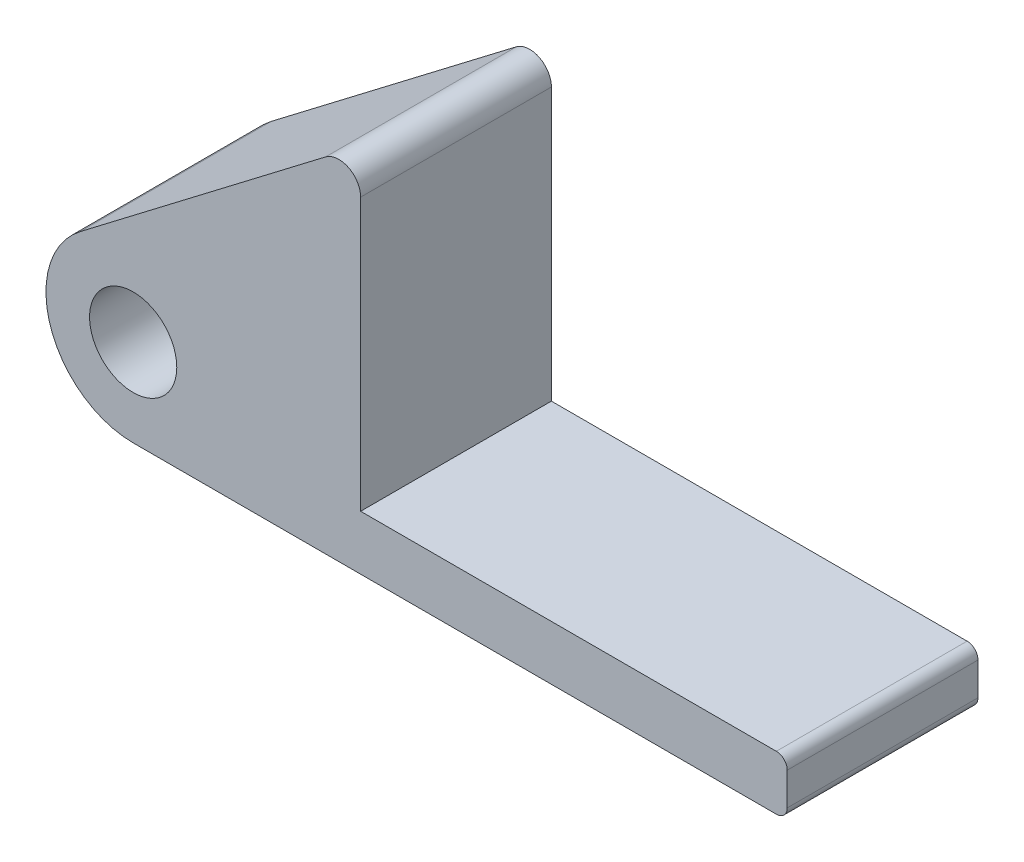
ISO-10303-21;
HEADER;
FILE_DESCRIPTION(('STEP AP214'),'2;1');
FILE_NAME('part.step','',(''),(''),'','','');
FILE_SCHEMA(('AUTOMOTIVE_DESIGN { 1 0 10303 214 1 1 1 1 }'));
ENDSEC;
DATA;
#1=APPLICATION_CONTEXT('core data for automotive mechanical design processes');
#2=APPLICATION_PROTOCOL_DEFINITION('international standard','automotive_design',2000,#1);
#3=PRODUCT_CONTEXT('',#1,'mechanical');
#4=PRODUCT('Part','Part','',(#3));
#5=PRODUCT_RELATED_PRODUCT_CATEGORY('part','',(#4));
#6=PRODUCT_DEFINITION_FORMATION('','',#4);
#7=PRODUCT_DEFINITION_CONTEXT('part definition',#1,'design');
#8=PRODUCT_DEFINITION('design','',#6,#7);
#9=PRODUCT_DEFINITION_SHAPE('','',#8);
#10=(LENGTH_UNIT() NAMED_UNIT(*) SI_UNIT(.MILLI.,.METRE.));
#11=(NAMED_UNIT(*) PLANE_ANGLE_UNIT() SI_UNIT($,.RADIAN.));
#12=(NAMED_UNIT(*) SI_UNIT($,.STERADIAN.) SOLID_ANGLE_UNIT());
#13=UNCERTAINTY_MEASURE_WITH_UNIT(LENGTH_MEASURE(1.E-05),#10,'distance_accuracy_value','');
#14=(GEOMETRIC_REPRESENTATION_CONTEXT(3) GLOBAL_UNCERTAINTY_ASSIGNED_CONTEXT((#13)) GLOBAL_UNIT_ASSIGNED_CONTEXT((#10,
#11,#12)) REPRESENTATION_CONTEXT('',''));
#15=CARTESIAN_POINT('',(0.,0.,0.));
#16=DIRECTION('',(0.,0.,1.));
#17=DIRECTION('',(1.,0.,0.));
#18=AXIS2_PLACEMENT_3D('',#15,#16,#17);
#19=CARTESIAN_POINT('',(-4.85521438282336,6.358214631233,-17.5));
#20=DIRECTION('',(0.606901797852919,-0.794776828904124,0.));
#21=DIRECTION('',(0.794776828904124,0.606901797852919,0.));
#22=AXIS2_PLACEMENT_3D('',#19,#20,#21);
#23=PLANE('',#22);
#24=DIRECTION('',(0.794776828904124,0.606901797852919,0.));
#25=VECTOR('',#24,1.);
#26=CARTESIAN_POINT('',(-4.85521438282336,6.358214631233,0.));
#27=LINE('',#26,#25);
#28=CARTESIAN_POINT('',(-4.85521438282336,6.35821463123299,0.));
#29=VERTEX_POINT('',#28);
#30=CARTESIAN_POINT('',(17.653159719134,23.5458982833339,0.));
#31=VERTEX_POINT('',#30);
#32=EDGE_CURVE('E165',#29,#31,#27,.T.);
#33=ORIENTED_EDGE('',*,*,#32,.T.);
#34=DIRECTION('',(0.,0.,1.));
#35=VECTOR('',#34,1.);
#36=CARTESIAN_POINT('',(17.653159719134,23.5458982833339,-17.5));
#37=LINE('',#36,#35);
#38=CARTESIAN_POINT('',(17.653159719134,23.5458982833339,-17.5));
#39=VERTEX_POINT('',#38);
#40=EDGE_CURVE('E137',#31,#39,#37,.F.);
#41=ORIENTED_EDGE('',*,*,#40,.T.);
#42=DIRECTION('',(0.794776828904124,0.606901797852919,0.));
#43=VECTOR('',#42,1.);
#44=CARTESIAN_POINT('',(-4.85521438282336,6.358214631233,-17.5));
#45=LINE('',#44,#43);
#46=CARTESIAN_POINT('',(-4.85521438282336,6.35821463123299,-17.5));
#47=VERTEX_POINT('',#46);
#48=EDGE_CURVE('E135',#47,#39,#45,.T.);
#49=ORIENTED_EDGE('',*,*,#48,.F.);
#50=DIRECTION('',(0.,0.,1.));
#51=VECTOR('',#50,1.);
#52=CARTESIAN_POINT('',(-4.85521438282336,6.35821463123299,-17.5));
#53=LINE('',#52,#51);
#54=EDGE_CURVE('E119',#47,#29,#53,.T.);
#55=ORIENTED_EDGE('',*,*,#54,.T.);
#56=EDGE_LOOP('',(#33,#41,#49,#55));
#57=FACE_BOUND('',#56,.T.);
#58=ADVANCED_FACE('F45',(#57),#23,.F.);
#59=CARTESIAN_POINT('',(20.8669633148398,0.,-17.5));
#60=DIRECTION('',(-1.,0.,0.));
#61=DIRECTION('',(0.,-1.,0.));
#62=AXIS2_PLACEMENT_3D('',#59,#60,#61);
#63=PLANE('',#62);
#64=DIRECTION('',(0.,-1.,0.));
#65=VECTOR('',#64,1.);
#66=CARTESIAN_POINT('',(20.8669633148398,0.,-17.5));
#67=LINE('',#66,#65);
#68=CARTESIAN_POINT('',(20.8669633148398,21.9563446255256,-17.5));
#69=VERTEX_POINT('',#68);
#70=CARTESIAN_POINT('',(20.8669633148398,-3.,-17.5));
#71=VERTEX_POINT('',#70);
#72=EDGE_CURVE('E159',#69,#71,#67,.T.);
#73=ORIENTED_EDGE('',*,*,#72,.F.);
#74=DIRECTION('',(0.,0.,1.));
#75=VECTOR('',#74,1.);
#76=CARTESIAN_POINT('',(20.8669633148398,21.9563446255256,-17.5));
#77=LINE('',#76,#75);
#78=CARTESIAN_POINT('',(20.8669633148398,21.9563446255256,0.));
#79=VERTEX_POINT('',#78);
#80=EDGE_CURVE('E189',#69,#79,#77,.T.);
#81=ORIENTED_EDGE('',*,*,#80,.T.);
#82=DIRECTION('',(0.,-1.,0.));
#83=VECTOR('',#82,1.);
#84=CARTESIAN_POINT('',(20.8669633148398,0.,0.));
#85=LINE('',#84,#83);
#86=CARTESIAN_POINT('',(20.8669633148398,-3.,0.));
#87=VERTEX_POINT('',#86);
#88=EDGE_CURVE('E179',#79,#87,#85,.T.);
#89=ORIENTED_EDGE('',*,*,#88,.T.);
#90=DIRECTION('',(0.,0.,1.));
#91=VECTOR('',#90,1.);
#92=CARTESIAN_POINT('',(20.8669633148398,-3.,-17.5));
#93=LINE('',#92,#91);
#94=EDGE_CURVE('E185',#71,#87,#93,.T.);
#95=ORIENTED_EDGE('',*,*,#94,.F.);
#96=EDGE_LOOP('',(#73,#81,#89,#95));
#97=FACE_BOUND('',#96,.T.);
#98=ADVANCED_FACE('F243',(#97),#63,.F.);
#99=CARTESIAN_POINT('',(0.,-3.00000000000001,-17.5));
#100=DIRECTION('',(0.,-1.,0.));
#101=DIRECTION('',(1.,0.,0.));
#102=AXIS2_PLACEMENT_3D('',#99,#100,#101);
#103=PLANE('',#102);
#104=DIRECTION('',(1.,0.,0.));
#105=VECTOR('',#104,1.);
#106=CARTESIAN_POINT('',(0.,-3.00000000000001,0.));
#107=LINE('',#106,#105);
#108=CARTESIAN_POINT('',(59.,-3.,0.));
#109=VERTEX_POINT('',#108);
#110=EDGE_CURVE('E176',#87,#109,#107,.T.);
#111=ORIENTED_EDGE('',*,*,#110,.T.);
#112=DIRECTION('',(0.,0.,1.));
#113=VECTOR('',#112,1.);
#114=CARTESIAN_POINT('',(59.,-3.,-17.5));
#115=LINE('',#114,#113);
#116=CARTESIAN_POINT('',(59.,-3.,-17.5));
#117=VERTEX_POINT('',#116);
#118=EDGE_CURVE('E11',#109,#117,#115,.F.);
#119=ORIENTED_EDGE('',*,*,#118,.T.);
#120=DIRECTION('',(1.,0.,0.));
#121=VECTOR('',#120,1.);
#122=CARTESIAN_POINT('',(0.,-3.00000000000001,-17.5));
#123=LINE('',#122,#121);
#124=EDGE_CURVE('E156',#71,#117,#123,.T.);
#125=ORIENTED_EDGE('',*,*,#124,.F.);
#126=ORIENTED_EDGE('',*,*,#94,.T.);
#127=EDGE_LOOP('',(#111,#119,#125,#126));
#128=FACE_BOUND('',#127,.T.);
#129=ADVANCED_FACE('F239',(#128),#103,.F.);
#130=CARTESIAN_POINT('',(60.,0.,-17.5));
#131=DIRECTION('',(-1.,0.,0.));
#132=DIRECTION('',(0.,0.,1.));
#133=AXIS2_PLACEMENT_3D('',#130,#131,#132);
#134=PLANE('',#133);
#135=DIRECTION('',(0.,-1.,0.));
#136=VECTOR('',#135,1.);
#137=CARTESIAN_POINT('',(60.,0.,0.));
#138=LINE('',#137,#136);
#139=CARTESIAN_POINT('',(60.,-4.,0.));
#140=VERTEX_POINT('',#139);
#141=CARTESIAN_POINT('',(60.,-7.,0.));
#142=VERTEX_POINT('',#141);
#143=EDGE_CURVE('E173',#140,#142,#138,.T.);
#144=ORIENTED_EDGE('',*,*,#143,.T.);
#145=DIRECTION('',(0.,0.,1.));
#146=VECTOR('',#145,1.);
#147=CARTESIAN_POINT('',(60.,-7.,-17.5));
#148=LINE('',#147,#146);
#149=CARTESIAN_POINT('',(60.,-7.,-17.5));
#150=VERTEX_POINT('',#149);
#151=EDGE_CURVE('E67',#142,#150,#148,.F.);
#152=ORIENTED_EDGE('',*,*,#151,.T.);
#153=DIRECTION('',(0.,-1.,0.));
#154=VECTOR('',#153,1.);
#155=CARTESIAN_POINT('',(60.,0.,-17.5));
#156=LINE('',#155,#154);
#157=CARTESIAN_POINT('',(60.,-4.,-17.5));
#158=VERTEX_POINT('',#157);
#159=EDGE_CURVE('E151',#158,#150,#156,.T.);
#160=ORIENTED_EDGE('',*,*,#159,.F.);
#161=DIRECTION('',(0.,0.,1.));
#162=VECTOR('',#161,1.);
#163=CARTESIAN_POINT('',(60.,-4.,-17.5));
#164=LINE('',#163,#162);
#165=EDGE_CURVE('E213',#158,#140,#164,.T.);
#166=ORIENTED_EDGE('',*,*,#165,.T.);
#167=EDGE_LOOP('',(#144,#152,#160,#166));
#168=FACE_BOUND('',#167,.T.);
#169=ADVANCED_FACE('F233',(#168),#134,.F.);
#170=CARTESIAN_POINT('',(0.,-8.,-17.5));
#171=DIRECTION('',(0.,1.,0.));
#172=DIRECTION('',(0.,0.,1.));
#173=AXIS2_PLACEMENT_3D('',#170,#171,#172);
#174=PLANE('',#173);
#175=DIRECTION('',(-1.,0.,0.));
#176=VECTOR('',#175,1.);
#177=CARTESIAN_POINT('',(0.,-8.,-17.5));
#178=LINE('',#177,#176);
#179=CARTESIAN_POINT('',(59.,-8.,-17.5));
#180=VERTEX_POINT('',#179);
#181=CARTESIAN_POINT('',(0.,-8.,-17.5));
#182=VERTEX_POINT('',#181);
#183=EDGE_CURVE('E146',#180,#182,#178,.T.);
#184=ORIENTED_EDGE('',*,*,#183,.F.);
#185=DIRECTION('',(0.,0.,1.));
#186=VECTOR('',#185,1.);
#187=CARTESIAN_POINT('',(59.,-8.,-17.5));
#188=LINE('',#187,#186);
#189=CARTESIAN_POINT('',(59.,-8.,0.));
#190=VERTEX_POINT('',#189);
#191=EDGE_CURVE('E203',#180,#190,#188,.T.);
#192=ORIENTED_EDGE('',*,*,#191,.T.);
#193=DIRECTION('',(-1.,0.,0.));
#194=VECTOR('',#193,1.);
#195=CARTESIAN_POINT('',(0.,-8.,0.));
#196=LINE('',#195,#194);
#197=CARTESIAN_POINT('',(0.,-8.,0.));
#198=VERTEX_POINT('',#197);
#199=EDGE_CURVE('E170',#190,#198,#196,.T.);
#200=ORIENTED_EDGE('',*,*,#199,.T.);
#201=DIRECTION('',(0.,0.,1.));
#202=VECTOR('',#201,1.);
#203=CARTESIAN_POINT('',(0.,-8.,-17.5));
#204=LINE('',#203,#202);
#205=EDGE_CURVE('E131',#182,#198,#204,.T.);
#206=ORIENTED_EDGE('',*,*,#205,.F.);
#207=EDGE_LOOP('',(#184,#192,#200,#206));
#208=FACE_BOUND('',#207,.T.);
#209=ADVANCED_FACE('F226',(#208),#174,.F.);
#210=CARTESIAN_POINT('',(0.,0.,-17.5));
#211=DIRECTION('',(0.,0.,1.));
#212=DIRECTION('',(1.,0.,0.));
#213=AXIS2_PLACEMENT_3D('',#210,#211,#212);
#214=CYLINDRICAL_SURFACE('',#213,8.);
#215=CARTESIAN_POINT('',(0.,0.,0.));
#216=DIRECTION('',(0.,0.,1.));
#217=DIRECTION('',(1.,0.,0.));
#218=AXIS2_PLACEMENT_3D('',#215,#216,#217);
#219=CIRCLE('',#218,8.);
#220=EDGE_CURVE('E126',#29,#198,#219,.T.);
#221=ORIENTED_EDGE('',*,*,#220,.F.);
#222=ORIENTED_EDGE('',*,*,#54,.F.);
#223=CARTESIAN_POINT('',(0.,0.,-17.5));
#224=DIRECTION('',(0.,0.,1.));
#225=DIRECTION('',(1.,0.,0.));
#226=AXIS2_PLACEMENT_3D('',#223,#224,#225);
#227=CIRCLE('',#226,8.);
#228=EDGE_CURVE('E124',#47,#182,#227,.T.);
#229=ORIENTED_EDGE('',*,*,#228,.T.);
#230=ORIENTED_EDGE('',*,*,#205,.T.);
#231=EDGE_LOOP('',(#221,#222,#229,#230));
#232=FACE_BOUND('',#231,.T.);
#233=ADVANCED_FACE('F121',(#232),#214,.T.);
#234=CARTESIAN_POINT('',(0.,0.,-17.5));
#235=DIRECTION('',(0.,0.,1.));
#236=DIRECTION('',(1.,0.,0.));
#237=AXIS2_PLACEMENT_3D('',#234,#235,#236);
#238=CYLINDRICAL_SURFACE('',#237,4.);
#239=CARTESIAN_POINT('',(0.,0.,-17.5));
#240=DIRECTION('',(0.,0.,1.));
#241=DIRECTION('',(1.,0.,0.));
#242=AXIS2_PLACEMENT_3D('',#239,#240,#241);
#243=CIRCLE('',#242,4.);
#244=CARTESIAN_POINT('',(4.,0.,-17.5));
#245=VERTEX_POINT('',#244);
#246=EDGE_CURVE('E132',#245,#245,#243,.T.);
#247=ORIENTED_EDGE('',*,*,#246,.F.);
#248=EDGE_LOOP('',(#247));
#249=FACE_BOUND('',#248,.T.);
#250=CARTESIAN_POINT('',(0.,0.,0.));
#251=DIRECTION('',(0.,0.,1.));
#252=DIRECTION('',(1.,0.,0.));
#253=AXIS2_PLACEMENT_3D('',#250,#251,#252);
#254=CIRCLE('',#253,4.);
#255=CARTESIAN_POINT('',(4.,0.,0.));
#256=VERTEX_POINT('',#255);
#257=EDGE_CURVE('E141',#256,#256,#254,.T.);
#258=ORIENTED_EDGE('',*,*,#257,.T.);
#259=EDGE_LOOP('',(#258));
#260=FACE_BOUND('',#259,.T.);
#261=ADVANCED_FACE('F263',(#249,#260),#238,.F.);
#262=CARTESIAN_POINT('',(0.,0.,-17.5));
#263=DIRECTION('',(0.,0.,1.));
#264=DIRECTION('',(1.,0.,0.));
#265=AXIS2_PLACEMENT_3D('',#262,#263,#264);
#266=PLANE('',#265);
#267=ORIENTED_EDGE('',*,*,#159,.T.);
#268=CARTESIAN_POINT('',(59.,-7.,-17.5));
#269=DIRECTION('',(0.,0.,1.));
#270=DIRECTION('',(1.,0.,0.));
#271=AXIS2_PLACEMENT_3D('',#268,#269,#270);
#272=CIRCLE('',#271,1.);
#273=EDGE_CURVE('E54',#150,#180,#272,.F.);
#274=ORIENTED_EDGE('',*,*,#273,.T.);
#275=ORIENTED_EDGE('',*,*,#183,.T.);
#276=ORIENTED_EDGE('',*,*,#228,.F.);
#277=ORIENTED_EDGE('',*,*,#48,.T.);
#278=CARTESIAN_POINT('',(18.8669633148398,21.9563446255256,-17.5));
#279=DIRECTION('',(0.,0.,1.));
#280=DIRECTION('',(1.,0.,0.));
#281=AXIS2_PLACEMENT_3D('',#278,#279,#280);
#282=CIRCLE('',#281,2.);
#283=EDGE_CURVE('E200',#39,#69,#282,.F.);
#284=ORIENTED_EDGE('',*,*,#283,.T.);
#285=ORIENTED_EDGE('',*,*,#72,.T.);
#286=ORIENTED_EDGE('',*,*,#124,.T.);
#287=CARTESIAN_POINT('',(59.,-4.,-17.5));
#288=DIRECTION('',(0.,0.,1.));
#289=DIRECTION('',(1.,0.,0.));
#290=AXIS2_PLACEMENT_3D('',#287,#288,#289);
#291=CIRCLE('',#290,1.);
#292=EDGE_CURVE('E219',#117,#158,#291,.F.);
#293=ORIENTED_EDGE('',*,*,#292,.T.);
#294=EDGE_LOOP('',(#267,#274,#275,#276,#277,#284,#285,#286,#293));
#295=FACE_BOUND('',#294,.T.);
#296=ORIENTED_EDGE('',*,*,#246,.T.);
#297=EDGE_LOOP('',(#296));
#298=FACE_BOUND('',#297,.T.);
#299=ADVANCED_FACE('F143',(#295,#298),#266,.F.);
#300=CARTESIAN_POINT('',(0.,0.,0.));
#301=DIRECTION('',(0.,0.,1.));
#302=DIRECTION('',(1.,0.,0.));
#303=AXIS2_PLACEMENT_3D('',#300,#301,#302);
#304=PLANE('',#303);
#305=ORIENTED_EDGE('',*,*,#199,.F.);
#306=CARTESIAN_POINT('',(59.,-7.,0.));
#307=DIRECTION('',(0.,0.,1.));
#308=DIRECTION('',(1.,0.,0.));
#309=AXIS2_PLACEMENT_3D('',#306,#307,#308);
#310=CIRCLE('',#309,1.);
#311=EDGE_CURVE('E210',#190,#142,#310,.T.);
#312=ORIENTED_EDGE('',*,*,#311,.T.);
#313=ORIENTED_EDGE('',*,*,#143,.F.);
#314=CARTESIAN_POINT('',(59.,-4.,0.));
#315=DIRECTION('',(0.,0.,1.));
#316=DIRECTION('',(1.,0.,0.));
#317=AXIS2_PLACEMENT_3D('',#314,#315,#316);
#318=CIRCLE('',#317,1.);
#319=EDGE_CURVE('E207',#140,#109,#318,.T.);
#320=ORIENTED_EDGE('',*,*,#319,.T.);
#321=ORIENTED_EDGE('',*,*,#110,.F.);
#322=ORIENTED_EDGE('',*,*,#88,.F.);
#323=CARTESIAN_POINT('',(18.8669633148398,21.9563446255256,0.));
#324=DIRECTION('',(0.,0.,1.));
#325=DIRECTION('',(1.,0.,0.));
#326=AXIS2_PLACEMENT_3D('',#323,#324,#325);
#327=CIRCLE('',#326,2.);
#328=EDGE_CURVE('E195',#79,#31,#327,.T.);
#329=ORIENTED_EDGE('',*,*,#328,.T.);
#330=ORIENTED_EDGE('',*,*,#32,.F.);
#331=ORIENTED_EDGE('',*,*,#220,.T.);
#332=EDGE_LOOP('',(#305,#312,#313,#320,#321,#322,#329,#330,#331));
#333=FACE_BOUND('',#332,.T.);
#334=ORIENTED_EDGE('',*,*,#257,.F.);
#335=EDGE_LOOP('',(#334));
#336=FACE_BOUND('',#335,.T.);
#337=ADVANCED_FACE('F231',(#333,#336),#304,.T.);
#338=CARTESIAN_POINT('',(18.8669633148398,21.9563446255256,-17.5));
#339=DIRECTION('',(0.,0.,1.));
#340=DIRECTION('',(1.,0.,0.));
#341=AXIS2_PLACEMENT_3D('',#338,#339,#340);
#342=CYLINDRICAL_SURFACE('',#341,2.);
#343=ORIENTED_EDGE('',*,*,#283,.F.);
#344=ORIENTED_EDGE('',*,*,#40,.F.);
#345=ORIENTED_EDGE('',*,*,#328,.F.);
#346=ORIENTED_EDGE('',*,*,#80,.F.);
#347=EDGE_LOOP('',(#343,#344,#345,#346));
#348=FACE_BOUND('',#347,.T.);
#349=ADVANCED_FACE('F246',(#348),#342,.T.);
#350=CARTESIAN_POINT('',(59.,-7.,-17.5));
#351=DIRECTION('',(0.,0.,1.));
#352=DIRECTION('',(1.,0.,0.));
#353=AXIS2_PLACEMENT_3D('',#350,#351,#352);
#354=CYLINDRICAL_SURFACE('',#353,1.);
#355=ORIENTED_EDGE('',*,*,#273,.F.);
#356=ORIENTED_EDGE('',*,*,#151,.F.);
#357=ORIENTED_EDGE('',*,*,#311,.F.);
#358=ORIENTED_EDGE('',*,*,#191,.F.);
#359=EDGE_LOOP('',(#355,#356,#357,#358));
#360=FACE_BOUND('',#359,.T.);
#361=ADVANCED_FACE('F228',(#360),#354,.T.);
#362=CARTESIAN_POINT('',(59.,-4.,-17.5));
#363=DIRECTION('',(0.,0.,1.));
#364=DIRECTION('',(1.,0.,0.));
#365=AXIS2_PLACEMENT_3D('',#362,#363,#364);
#366=CYLINDRICAL_SURFACE('',#365,1.);
#367=ORIENTED_EDGE('',*,*,#292,.F.);
#368=ORIENTED_EDGE('',*,*,#118,.F.);
#369=ORIENTED_EDGE('',*,*,#319,.F.);
#370=ORIENTED_EDGE('',*,*,#165,.F.);
#371=EDGE_LOOP('',(#367,#368,#369,#370));
#372=FACE_BOUND('',#371,.T.);
#373=ADVANCED_FACE('F47',(#372),#366,.T.);
#374=CLOSED_SHELL('',(#58,#98,#129,#169,#209,#233,#261,#299,#337,#349,#361,#373));
#375=MANIFOLD_SOLID_BREP('B2',#374);
#376=ADVANCED_BREP_SHAPE_REPRESENTATION('',(#18,#375),#14);
#377=SHAPE_DEFINITION_REPRESENTATION(#9,#376);
ENDSEC;
END-ISO-10303-21;
